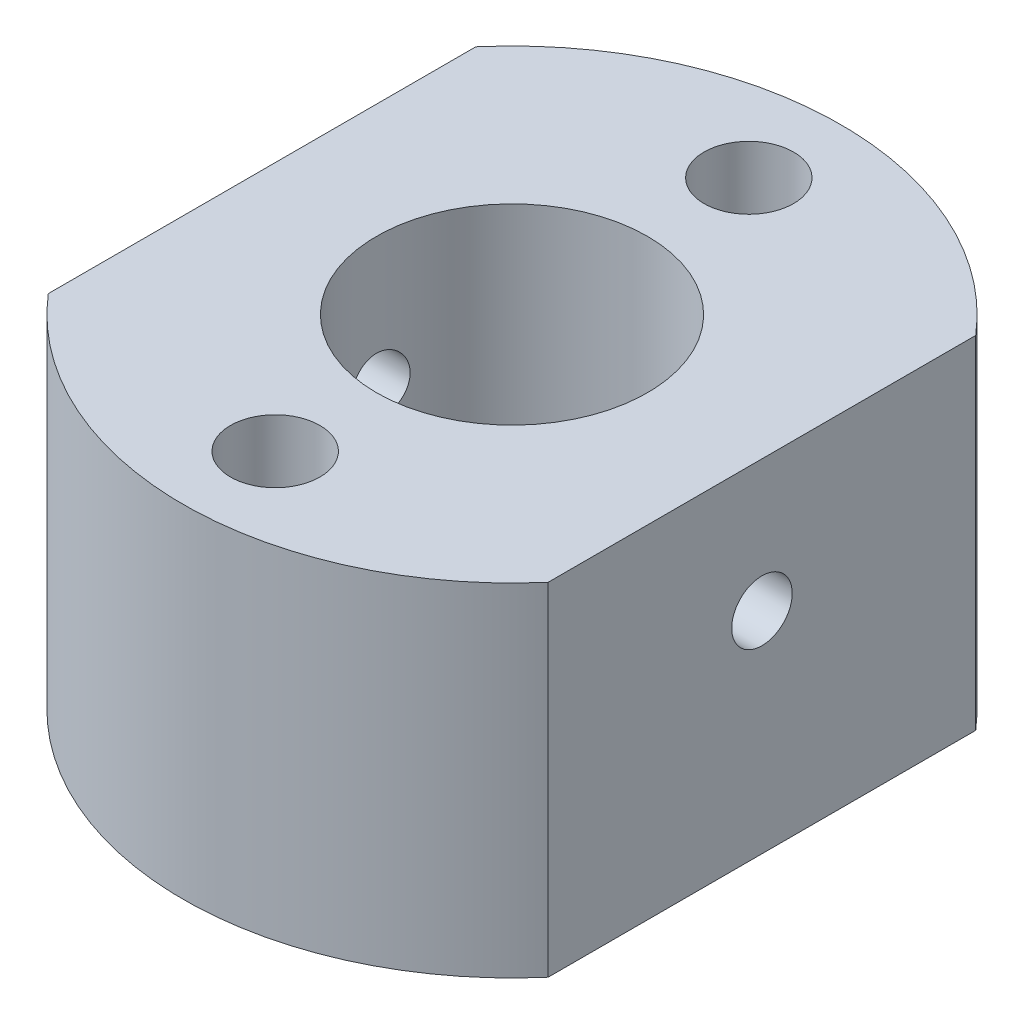
ISO-10303-21;
HEADER;
FILE_DESCRIPTION(('STEP AP214'),'2;1');
FILE_NAME('part.step','',(''),(''),'','','');
FILE_SCHEMA(('AUTOMOTIVE_DESIGN { 1 0 10303 214 1 1 1 1 }'));
ENDSEC;
DATA;
#1=APPLICATION_CONTEXT('core data for automotive mechanical design processes');
#2=APPLICATION_PROTOCOL_DEFINITION('international standard','automotive_design',2000,#1);
#3=PRODUCT_CONTEXT('',#1,'mechanical');
#4=PRODUCT('Part','Part','',(#3));
#5=PRODUCT_RELATED_PRODUCT_CATEGORY('part','',(#4));
#6=PRODUCT_DEFINITION_FORMATION('','',#4);
#7=PRODUCT_DEFINITION_CONTEXT('part definition',#1,'design');
#8=PRODUCT_DEFINITION('design','',#6,#7);
#9=PRODUCT_DEFINITION_SHAPE('','',#8);
#10=(LENGTH_UNIT() NAMED_UNIT(*) SI_UNIT(.MILLI.,.METRE.));
#11=(NAMED_UNIT(*) PLANE_ANGLE_UNIT() SI_UNIT($,.RADIAN.));
#12=(NAMED_UNIT(*) SI_UNIT($,.STERADIAN.) SOLID_ANGLE_UNIT());
#13=UNCERTAINTY_MEASURE_WITH_UNIT(LENGTH_MEASURE(1.E-05),#10,'distance_accuracy_value','');
#14=(GEOMETRIC_REPRESENTATION_CONTEXT(3) GLOBAL_UNCERTAINTY_ASSIGNED_CONTEXT((#13)) GLOBAL_UNIT_ASSIGNED_CONTEXT((#10,
#11,#12)) REPRESENTATION_CONTEXT('',''));
#15=CARTESIAN_POINT('',(0.,0.,0.));
#16=DIRECTION('',(0.,0.,1.));
#17=DIRECTION('',(1.,0.,0.));
#18=AXIS2_PLACEMENT_3D('',#15,#16,#17);
#19=CARTESIAN_POINT('',(-30.,8.,0.));
#20=DIRECTION('',(1.,0.,0.));
#21=DIRECTION('',(0.,0.,-1.));
#22=AXIS2_PLACEMENT_3D('',#19,#20,#21);
#23=CYLINDRICAL_SURFACE('',#22,1.15);
#24=CARTESIAN_POINT('',(5.01996015920446,8.,-1.15));
#25=CARTESIAN_POINT('',(5.01996144618436,7.93627408614581,-1.14999785500141));
#26=CARTESIAN_POINT('',(5.02118683554871,7.87252269176245,-1.14468503358324));
#27=CARTESIAN_POINT('',(5.02594650411922,7.74683532765452,-1.12359883078287));
#28=CARTESIAN_POINT('',(5.02948240705055,7.68490066665538,-1.10781809290088));
#29=CARTESIAN_POINT('',(5.03844313066154,7.56468302799714,-1.0663197533758));
#30=CARTESIAN_POINT('',(5.04386582787509,7.50639603176772,-1.04061331891514));
#31=CARTESIAN_POINT('',(5.05598657127394,7.39496003870444,-0.980025569180663));
#32=CARTESIAN_POINT('',(5.06268460255022,7.3418109818175,-0.945144361160827));
#33=CARTESIAN_POINT('',(5.07673304581199,7.2412236044887,-0.866542700558881));
#34=CARTESIAN_POINT('',(5.08409210007078,7.19388889511673,-0.822691177059024));
#35=CARTESIAN_POINT('',(5.09855784742948,7.10718204437733,-0.727676536560787));
#36=CARTESIAN_POINT('',(5.10566452035658,7.06781053833184,-0.676512836736153));
#37=CARTESIAN_POINT('',(5.11891910726237,6.99773589983633,-0.567629396385614));
#38=CARTESIAN_POINT('',(5.1250556340696,6.96713272026362,-0.509843823183602));
#39=CARTESIAN_POINT('',(5.13558075208989,6.91611055135396,-0.389789965176114));
#40=CARTESIAN_POINT('',(5.1399695478762,6.89569037001872,-0.327522206021947));
#41=CARTESIAN_POINT('',(5.14644363062737,6.86594056115,-0.201349279714289));
#42=CARTESIAN_POINT('',(5.14856531823395,6.85643548889891,-0.137487379351078));
#43=CARTESIAN_POINT('',(5.150392346618,6.84823686953825,-0.00904254290756566));
#44=CARTESIAN_POINT('',(5.15009797502408,6.84954203548451,0.0555403064305854));
#45=CARTESIAN_POINT('',(5.14715377216678,6.86279679539235,0.182383295520679));
#46=CARTESIAN_POINT('',(5.14454579716461,6.87455724692479,0.244664315127214));
#47=CARTESIAN_POINT('',(5.13731525227674,6.90808697661796,0.366345799906251));
#48=CARTESIAN_POINT('',(5.13269258881661,6.92985671967389,0.425746131139567));
#49=CARTESIAN_POINT('',(5.12188521387586,6.98295236773976,0.540501419490795));
#50=CARTESIAN_POINT('',(5.11568894423375,7.01434935523668,0.595822354633989));
#51=CARTESIAN_POINT('',(5.10241278694039,7.08575512476294,0.70047892725464));
#52=CARTESIAN_POINT('',(5.09533277424468,7.12576512606499,0.749813715775391));
#53=CARTESIAN_POINT('',(5.08088559254824,7.21428880850708,0.842223004282889));
#54=CARTESIAN_POINT('',(5.07351552566623,7.26296801061654,0.885138633969616));
#55=CARTESIAN_POINT('',(5.05946218977643,7.36690886367503,0.96222776726211));
#56=CARTESIAN_POINT('',(5.05277894101639,7.42217070858016,0.996401013182086));
#57=CARTESIAN_POINT('',(5.04084786569174,7.53797251622521,1.05511011869875));
#58=CARTESIAN_POINT('',(5.03560469479367,7.59852878266829,1.07961482953781));
#59=CARTESIAN_POINT('',(5.027211135079,7.72304479046884,1.1180515654989));
#60=CARTESIAN_POINT('',(5.0240603987105,7.78700396469849,1.13198534649978));
#61=CARTESIAN_POINT('',(5.02027963129785,7.91505554034238,1.14863592053319));
#62=CARTESIAN_POINT('',(5.01959751372509,7.97911629562799,1.15158453461648));
#63=CARTESIAN_POINT('',(5.02069053187803,8.10681404302228,1.14680968243556));
#64=CARTESIAN_POINT('',(5.02246549106664,8.17045106524544,1.13908698288847));
#65=CARTESIAN_POINT('',(5.02822338058637,8.29468041112667,1.11339016736195));
#66=CARTESIAN_POINT('',(5.03217857829787,8.35530075679089,1.09554473135104));
#67=CARTESIAN_POINT('',(5.0418260943487,8.47269087380142,1.05024879549898));
#68=CARTESIAN_POINT('',(5.04751858469059,8.52946026319905,1.02279734456432));
#69=CARTESIAN_POINT('',(5.06011305966654,8.63853730880166,0.95856145290376));
#70=CARTESIAN_POINT('',(5.06703292973731,8.69075910049446,0.921634787577442));
#71=CARTESIAN_POINT('',(5.08125577015493,8.78834993415477,0.839681897142961));
#72=CARTESIAN_POINT('',(5.08855879010248,8.83371808591959,0.794654621527373));
#73=CARTESIAN_POINT('',(5.1028974339963,8.91721902057919,0.696727542690013));
#74=CARTESIAN_POINT('',(5.10992506450556,8.95519342598895,0.643691321974526));
#75=CARTESIAN_POINT('',(5.12277172402382,9.02169391641005,0.531858096610749));
#76=CARTESIAN_POINT('',(5.12859081069878,9.05022045226752,0.473061367023712));
#77=CARTESIAN_POINT('',(5.13833114400079,9.09679757510956,0.351749995020986));
#78=CARTESIAN_POINT('',(5.14226466461949,9.11491607031735,0.289262456276952));
#79=CARTESIAN_POINT('',(5.1478438354328,9.14037392028573,0.162032412650774));
#80=CARTESIAN_POINT('',(5.14948983306023,9.14771491196115,0.0972902517358851));
#81=CARTESIAN_POINT('',(5.15029764439413,9.15133317732604,-0.0311100070130711));
#82=CARTESIAN_POINT('',(5.14951246317111,9.14784651292218,-0.0947612329767144));
#83=CARTESIAN_POINT('',(5.14566025486308,9.1304382133656,-0.220546086903893));
#84=CARTESIAN_POINT('',(5.14259327221564,9.1165167814276,-0.282679744397395));
#85=CARTESIAN_POINT('',(5.13452660237019,9.07874924782231,-0.403474104036066));
#86=CARTESIAN_POINT('',(5.12953369180321,9.05493792274266,-0.462146160880239));
#87=CARTESIAN_POINT('',(5.11814723955162,8.99809994082388,-0.574693041206362));
#88=CARTESIAN_POINT('',(5.1117535558096,8.9650723492372,-0.628567377354378));
#89=CARTESIAN_POINT('',(5.09810471530515,8.88997651818667,-0.731136720941618));
#90=CARTESIAN_POINT('',(5.09083507325497,8.84774305157684,-0.779708840287559));
#91=CARTESIAN_POINT('',(5.07632977226076,8.7557659112013,-0.869157135635299));
#92=CARTESIAN_POINT('',(5.06909412198245,8.70602041922911,-0.910031443066062));
#93=CARTESIAN_POINT('',(5.05536224457789,8.59958946108056,-0.983479492811113));
#94=CARTESIAN_POINT('',(5.04887785152385,8.54281620917435,-1.01592837470297));
#95=CARTESIAN_POINT('',(5.03753273981643,8.42448860809766,-1.07077270599597));
#96=CARTESIAN_POINT('',(5.03267067381953,8.36293827892658,-1.09317650318828));
#97=CARTESIAN_POINT('',(5.02600081428275,8.25112230538823,-1.12338516547385));
#98=CARTESIAN_POINT('',(5.0237508698246,8.20145432838289,-1.13334624287535));
#99=CARTESIAN_POINT('',(5.02073007044117,8.10119622452491,-1.14665433669804));
#100=CARTESIAN_POINT('',(5.01995913718548,8.05060614665122,-1.15000170339045));
#101=CARTESIAN_POINT('',(5.01996015920446,8.,-1.15));
#102=B_SPLINE_CURVE_WITH_KNOTS('',3,(#24,#25,#26,#27,#28,#29,#30,#31,#32,#33,#34,#35,#36,#37,
#38,#39,#40,#41,#42,#43,#44,#45,#46,#47,#48,#49,#50,#51,#52,#53,#54,#55,#56,#57,#58,#59,#60,#61,
#62,#63,#64,#65,#66,#67,#68,#69,#70,#71,#72,#73,#74,#75,#76,#77,#78,#79,#80,#81,#82,#83,#84,#85,
#86,#87,#88,#89,#90,#91,#92,#93,#94,#95,#96,#97,#98,#99,#100,#101),.UNSPECIFIED.,.T.,.F.,(4,2,2,
2,2,2,2,2,2,2,2,2,2,2,2,2,2,2,2,2,2,2,2,2,2,2,2,2,2,2,2,2,2,2,2,2,2,2,4),(0.,0.190992225204412,
0.382118815727523,0.573030997573828,0.763940947737764,0.95787020172545,1.15181492171907,
1.34788971401983,1.54394154886669,1.73679596857334,1.92962742955336,2.11903987261118,
2.30846111407746,2.49931606604396,2.69019805354603,2.88521742596534,3.08024254600841,
3.27589093885363,3.47150682650375,3.66297044184989,3.85442030155111,4.043489309007,
4.23257704152347,4.42468848554959,4.61682486105108,4.81270867578664,5.00858314172794,
5.20316465045912,5.39771660259396,5.58805698835913,5.77839366738509,5.96806664257744,
6.15775886209472,6.35118664730564,6.54466132493379,6.74085777759889,6.93689088106917,
7.08857003176347,7.24024114910598),.UNSPECIFIED.);
#103=CARTESIAN_POINT('',(5.01996015920446,8.,-1.15));
#104=VERTEX_POINT('',#103);
#105=EDGE_CURVE('E96',#104,#104,#102,.T.);
#106=ORIENTED_EDGE('',*,*,#105,.T.);
#107=EDGE_LOOP('',(#106));
#108=FACE_BOUND('',#107,.T.);
#109=CARTESIAN_POINT('',(9.5,8.,0.));
#110=DIRECTION('',(1.,0.,0.));
#111=DIRECTION('',(0.,0.,-1.));
#112=AXIS2_PLACEMENT_3D('',#109,#110,#111);
#113=CIRCLE('',#112,1.15);
#114=CARTESIAN_POINT('',(9.5,8.,-1.15));
#115=VERTEX_POINT('',#114);
#116=EDGE_CURVE('E124',#115,#115,#113,.T.);
#117=ORIENTED_EDGE('',*,*,#116,.T.);
#118=EDGE_LOOP('',(#117));
#119=FACE_BOUND('',#118,.T.);
#120=ADVANCED_FACE('F39',(#108,#119),#23,.F.);
#121=CARTESIAN_POINT('',(-30.,8.,0.));
#122=DIRECTION('',(1.,0.,0.));
#123=DIRECTION('',(0.,0.,-1.));
#124=AXIS2_PLACEMENT_3D('',#121,#122,#123);
#125=CYLINDRICAL_SURFACE('',#124,1.15);
#126=CARTESIAN_POINT('',(-5.01996015920445,8.,-1.15));
#127=CARTESIAN_POINT('',(-5.01996144618434,8.06372591385419,-1.14999785500141));
#128=CARTESIAN_POINT('',(-5.02118683554871,8.12747730823755,-1.14468503358324));
#129=CARTESIAN_POINT('',(-5.02594650411922,8.25316467234548,-1.12359883078287));
#130=CARTESIAN_POINT('',(-5.02948240705055,8.31509933334462,-1.10781809290088));
#131=CARTESIAN_POINT('',(-5.03844313066153,8.43531697200286,-1.0663197533758));
#132=CARTESIAN_POINT('',(-5.04386582787509,8.49360396823228,-1.04061331891514));
#133=CARTESIAN_POINT('',(-5.05598657127394,8.60503996129556,-0.980025569180664));
#134=CARTESIAN_POINT('',(-5.06268460255022,8.6581890181825,-0.945144361160829));
#135=CARTESIAN_POINT('',(-5.07673304581199,8.7587763955113,-0.866542700558883));
#136=CARTESIAN_POINT('',(-5.08409210007078,8.80611110488327,-0.822691177059026));
#137=CARTESIAN_POINT('',(-5.09855784742948,8.89281795562267,-0.727676536560789));
#138=CARTESIAN_POINT('',(-5.10566452035658,8.93218946166816,-0.676512836736155));
#139=CARTESIAN_POINT('',(-5.11891910726237,9.00226410016367,-0.567629396385616));
#140=CARTESIAN_POINT('',(-5.1250556340696,9.03286727973638,-0.509843823183604));
#141=CARTESIAN_POINT('',(-5.13558075208989,9.08388944864604,-0.389789965176117));
#142=CARTESIAN_POINT('',(-5.1399695478762,9.10430962998128,-0.327522206021951));
#143=CARTESIAN_POINT('',(-5.14644363062737,9.13405943885,-0.201349279714293));
#144=CARTESIAN_POINT('',(-5.14856531823395,9.14356451110109,-0.137487379351082));
#145=CARTESIAN_POINT('',(-5.150392346618,9.15176313046175,-0.00904254290756949));
#146=CARTESIAN_POINT('',(-5.15009797502408,9.15045796451549,0.0555403064305815));
#147=CARTESIAN_POINT('',(-5.14715377216678,9.13720320460765,0.182383295520675));
#148=CARTESIAN_POINT('',(-5.14454579716461,9.12544275307521,0.24466431512721));
#149=CARTESIAN_POINT('',(-5.13731525227674,9.09191302338204,0.366345799906248));
#150=CARTESIAN_POINT('',(-5.13269258881661,9.07014328032611,0.425746131139564));
#151=CARTESIAN_POINT('',(-5.12188521387586,9.01704763226024,0.540501419490792));
#152=CARTESIAN_POINT('',(-5.11568894423375,8.98565064476332,0.595822354633986));
#153=CARTESIAN_POINT('',(-5.1024127869404,8.91424487523707,0.700478927254638));
#154=CARTESIAN_POINT('',(-5.09533277424468,8.87423487393501,0.749813715775388));
#155=CARTESIAN_POINT('',(-5.08088559254824,8.78571119149292,0.842223004282886));
#156=CARTESIAN_POINT('',(-5.07351552566623,8.73703198938346,0.885138633969614));
#157=CARTESIAN_POINT('',(-5.05946218977643,8.63309113632497,0.962227767262108));
#158=CARTESIAN_POINT('',(-5.05277894101639,8.57782929141985,0.996401013182085));
#159=CARTESIAN_POINT('',(-5.04084786569174,8.46202748377479,1.05511011869875));
#160=CARTESIAN_POINT('',(-5.03560469479367,8.40147121733171,1.07961482953781));
#161=CARTESIAN_POINT('',(-5.027211135079,8.27695520953116,1.1180515654989));
#162=CARTESIAN_POINT('',(-5.0240603987105,8.21299603530151,1.13198534649978));
#163=CARTESIAN_POINT('',(-5.02027963129785,8.08494445965762,1.14863592053319));
#164=CARTESIAN_POINT('',(-5.01959751372509,8.02088370437202,1.15158453461648));
#165=CARTESIAN_POINT('',(-5.02069053187803,7.89318595697773,1.14680968243556));
#166=CARTESIAN_POINT('',(-5.02246549106664,7.82954893475456,1.13908698288847));
#167=CARTESIAN_POINT('',(-5.02822338058637,7.70531958887334,1.11339016736195));
#168=CARTESIAN_POINT('',(-5.03217857829787,7.64469924320912,1.09554473135104));
#169=CARTESIAN_POINT('',(-5.0418260943487,7.52730912619859,1.05024879549899));
#170=CARTESIAN_POINT('',(-5.04751858469059,7.47053973680096,1.02279734456432));
#171=CARTESIAN_POINT('',(-5.06011305966653,7.36146269119834,0.958561452903762));
#172=CARTESIAN_POINT('',(-5.06703292973731,7.30924089950554,0.921634787577443));
#173=CARTESIAN_POINT('',(-5.08125577015493,7.21165006584523,0.839681897142963));
#174=CARTESIAN_POINT('',(-5.08855879010248,7.16628191408041,0.794654621527375));
#175=CARTESIAN_POINT('',(-5.1028974339963,7.08278097942081,0.696727542690015));
#176=CARTESIAN_POINT('',(-5.10992506450556,7.04480657401106,0.643691321974529));
#177=CARTESIAN_POINT('',(-5.12277172402382,6.97830608358996,0.531858096610752));
#178=CARTESIAN_POINT('',(-5.12859081069878,6.94977954773248,0.473061367023715));
#179=CARTESIAN_POINT('',(-5.13833114400079,6.90320242489044,0.351749995020989));
#180=CARTESIAN_POINT('',(-5.14226466461949,6.88508392968265,0.289262456276955));
#181=CARTESIAN_POINT('',(-5.1478438354328,6.85962607971427,0.162032412650777));
#182=CARTESIAN_POINT('',(-5.14948983306023,6.85228508803885,0.0972902517358887));
#183=CARTESIAN_POINT('',(-5.15029764439413,6.84866682267396,-0.031110007013067));
#184=CARTESIAN_POINT('',(-5.14951246317111,6.85215348707782,-0.0947612329767101));
#185=CARTESIAN_POINT('',(-5.14566025486308,6.86956178663439,-0.220546086903889));
#186=CARTESIAN_POINT('',(-5.14259327221564,6.8834832185724,-0.282679744397391));
#187=CARTESIAN_POINT('',(-5.13452660237019,6.92125075217769,-0.403474104036063));
#188=CARTESIAN_POINT('',(-5.12953369180321,6.94506207725734,-0.462146160880236));
#189=CARTESIAN_POINT('',(-5.11814723955162,7.00190005917612,-0.574693041206359));
#190=CARTESIAN_POINT('',(-5.1117535558096,7.03492765076279,-0.628567377354375));
#191=CARTESIAN_POINT('',(-5.09810471530515,7.11002348181333,-0.731136720941615));
#192=CARTESIAN_POINT('',(-5.09083507325497,7.15225694842316,-0.779708840287556));
#193=CARTESIAN_POINT('',(-5.07632977226076,7.24423408879869,-0.869157135635297));
#194=CARTESIAN_POINT('',(-5.06909412198245,7.29397958077089,-0.91003144306606));
#195=CARTESIAN_POINT('',(-5.05536224457789,7.40041053891944,-0.983479492811111));
#196=CARTESIAN_POINT('',(-5.04887785152385,7.45718379082565,-1.01592837470297));
#197=CARTESIAN_POINT('',(-5.03753273981643,7.57551139190234,-1.07077270599597));
#198=CARTESIAN_POINT('',(-5.03267067381953,7.63706172107342,-1.09317650318827));
#199=CARTESIAN_POINT('',(-5.02600081428275,7.74887769461176,-1.12338516547385));
#200=CARTESIAN_POINT('',(-5.02375086982461,7.7985456716171,-1.13334624287535));
#201=CARTESIAN_POINT('',(-5.02073007044117,7.89880377547509,-1.14665433669804));
#202=CARTESIAN_POINT('',(-5.01995913718547,7.94939385334878,-1.15000170339045));
#203=CARTESIAN_POINT('',(-5.01996015920445,8.,-1.15));
#204=B_SPLINE_CURVE_WITH_KNOTS('',3,(#126,#127,#128,#129,#130,#131,#132,#133,#134,#135,#136,
#137,#138,#139,#140,#141,#142,#143,#144,#145,#146,#147,#148,#149,#150,#151,#152,#153,#154,#155,
#156,#157,#158,#159,#160,#161,#162,#163,#164,#165,#166,#167,#168,#169,#170,#171,#172,#173,#174,
#175,#176,#177,#178,#179,#180,#181,#182,#183,#184,#185,#186,#187,#188,#189,#190,#191,#192,#193,
#194,#195,#196,#197,#198,#199,#200,#201,#202,#203),.UNSPECIFIED.,.T.,.F.,(4,2,2,2,2,2,2,2,2,2,2,
2,2,2,2,2,2,2,2,2,2,2,2,2,2,2,2,2,2,2,2,2,2,2,2,2,2,2,4),(0.,0.190992225204411,
0.382118815727522,0.573030997573826,0.76394094773776,0.957870201725448,1.15181492171907,
1.34788971401983,1.54394154886669,1.73679596857334,1.92962742955336,2.11903987261117,
2.30846111407746,2.49931606604396,2.69019805354603,2.88521742596534,3.0802425460084,
3.27589093885363,3.47150682650375,3.66297044184989,3.85442030155111,4.04348930900699,
4.23257704152347,4.42468848554959,4.61682486105108,4.81270867578664,5.00858314172793,
5.20316465045912,5.39771660259396,5.58805698835913,5.77839366738509,5.96806664257743,
6.15775886209472,6.35118664730564,6.54466132493378,6.74085777759889,6.93689088106917,
7.08857003176347,7.24024114910598),.UNSPECIFIED.);
#205=CARTESIAN_POINT('',(-5.01996015920445,8.,-1.15));
#206=VERTEX_POINT('',#205);
#207=EDGE_CURVE('E178',#206,#206,#204,.T.);
#208=ORIENTED_EDGE('',*,*,#207,.T.);
#209=EDGE_LOOP('',(#208));
#210=FACE_BOUND('',#209,.T.);
#211=CARTESIAN_POINT('',(-9.5,8.,0.));
#212=DIRECTION('',(1.,0.,0.));
#213=DIRECTION('',(0.,0.,-1.));
#214=AXIS2_PLACEMENT_3D('',#211,#212,#213);
#215=CIRCLE('',#214,1.15);
#216=CARTESIAN_POINT('',(-9.5,8.,-1.15));
#217=VERTEX_POINT('',#216);
#218=EDGE_CURVE('E43',#217,#217,#215,.F.);
#219=ORIENTED_EDGE('',*,*,#218,.T.);
#220=EDGE_LOOP('',(#219));
#221=FACE_BOUND('',#220,.T.);
#222=ADVANCED_FACE('F173',(#210,#221),#125,.F.);
#223=CARTESIAN_POINT('',(12.5,13.,0.));
#224=DIRECTION('',(0.,1.,0.));
#225=DIRECTION('',(0.,0.,1.));
#226=AXIS2_PLACEMENT_3D('',#223,#224,#225);
#227=PLANE('',#226);
#228=CARTESIAN_POINT('',(0.,13.,0.));
#229=DIRECTION('',(0.,1.,0.));
#230=DIRECTION('',(0.,0.,1.));
#231=AXIS2_PLACEMENT_3D('',#228,#229,#230);
#232=CIRCLE('',#231,5.15);
#233=CARTESIAN_POINT('',(0.,13.,5.15));
#234=VERTEX_POINT('',#233);
#235=EDGE_CURVE('E184',#234,#234,#232,.T.);
#236=ORIENTED_EDGE('',*,*,#235,.F.);
#237=EDGE_LOOP('',(#236));
#238=FACE_BOUND('',#237,.T.);
#239=CARTESIAN_POINT('',(0.,13.,-9.));
#240=DIRECTION('',(0.,-1.,0.));
#241=DIRECTION('',(0.,0.,-1.));
#242=AXIS2_PLACEMENT_3D('',#239,#240,#241);
#243=CIRCLE('',#242,1.7);
#244=CARTESIAN_POINT('',(0.,13.,-10.7));
#245=VERTEX_POINT('',#244);
#246=EDGE_CURVE('E116',#245,#245,#243,.T.);
#247=ORIENTED_EDGE('',*,*,#246,.T.);
#248=EDGE_LOOP('',(#247));
#249=FACE_BOUND('',#248,.T.);
#250=CARTESIAN_POINT('',(0.,13.,9.));
#251=DIRECTION('',(0.,-1.,0.));
#252=DIRECTION('',(0.,0.,-1.));
#253=AXIS2_PLACEMENT_3D('',#250,#251,#252);
#254=CIRCLE('',#253,1.7);
#255=CARTESIAN_POINT('',(0.,13.,7.3));
#256=VERTEX_POINT('',#255);
#257=EDGE_CURVE('E119',#256,#256,#254,.T.);
#258=ORIENTED_EDGE('',*,*,#257,.T.);
#259=EDGE_LOOP('',(#258));
#260=FACE_BOUND('',#259,.T.);
#261=CARTESIAN_POINT('',(0.,13.,0.));
#262=DIRECTION('',(0.,-1.,0.));
#263=DIRECTION('',(0.,0.,-1.));
#264=AXIS2_PLACEMENT_3D('',#261,#262,#263);
#265=CIRCLE('',#264,12.5);
#266=CARTESIAN_POINT('',(-9.5,13.,-8.12403840463596));
#267=VERTEX_POINT('',#266);
#268=CARTESIAN_POINT('',(9.5,13.,-8.12403840463596));
#269=VERTEX_POINT('',#268);
#270=EDGE_CURVE('E80',#267,#269,#265,.T.);
#271=ORIENTED_EDGE('',*,*,#270,.F.);
#272=DIRECTION('',(0.,0.,-1.));
#273=VECTOR('',#272,1.);
#274=CARTESIAN_POINT('',(-9.5,13.,-10.));
#275=LINE('',#274,#273);
#276=CARTESIAN_POINT('',(-9.5,13.,8.12403840463596));
#277=VERTEX_POINT('',#276);
#278=EDGE_CURVE('E83',#267,#277,#275,.F.);
#279=ORIENTED_EDGE('',*,*,#278,.T.);
#280=CARTESIAN_POINT('',(0.,13.,0.));
#281=DIRECTION('',(0.,-1.,0.));
#282=DIRECTION('',(0.,0.,-1.));
#283=AXIS2_PLACEMENT_3D('',#280,#281,#282);
#284=CIRCLE('',#283,12.5);
#285=CARTESIAN_POINT('',(9.5,13.,8.12403840463596));
#286=VERTEX_POINT('',#285);
#287=EDGE_CURVE('E122',#286,#277,#284,.T.);
#288=ORIENTED_EDGE('',*,*,#287,.F.);
#289=DIRECTION('',(0.,0.,1.));
#290=VECTOR('',#289,1.);
#291=CARTESIAN_POINT('',(9.5,13.,-10.));
#292=LINE('',#291,#290);
#293=EDGE_CURVE('E78',#286,#269,#292,.F.);
#294=ORIENTED_EDGE('',*,*,#293,.T.);
#295=EDGE_LOOP('',(#271,#279,#288,#294));
#296=FACE_BOUND('',#295,.T.);
#297=ADVANCED_FACE('F82',(#238,#249,#260,#296),#227,.T.);
#298=CARTESIAN_POINT('',(-9.5,18.,-10.));
#299=DIRECTION('',(1.,0.,0.));
#300=DIRECTION('',(0.,0.,-1.));
#301=AXIS2_PLACEMENT_3D('',#298,#299,#300);
#302=PLANE('',#301);
#303=ORIENTED_EDGE('',*,*,#218,.F.);
#304=EDGE_LOOP('',(#303));
#305=FACE_BOUND('',#304,.T.);
#306=ORIENTED_EDGE('',*,*,#278,.F.);
#307=DIRECTION('',(0.,-1.,0.));
#308=VECTOR('',#307,1.);
#309=CARTESIAN_POINT('',(-9.5,0.,-8.12403840463596));
#310=LINE('',#309,#308);
#311=CARTESIAN_POINT('',(-9.5,0.,-8.12403840463596));
#312=VERTEX_POINT('',#311);
#313=EDGE_CURVE('E89',#312,#267,#310,.F.);
#314=ORIENTED_EDGE('',*,*,#313,.F.);
#315=DIRECTION('',(0.,0.,-1.));
#316=VECTOR('',#315,1.);
#317=CARTESIAN_POINT('',(-9.5,0.,0.));
#318=LINE('',#317,#316);
#319=CARTESIAN_POINT('',(-9.5,0.,8.12403840463596));
#320=VERTEX_POINT('',#319);
#321=EDGE_CURVE('E115',#320,#312,#318,.T.);
#322=ORIENTED_EDGE('',*,*,#321,.F.);
#323=DIRECTION('',(0.,-1.,0.));
#324=VECTOR('',#323,1.);
#325=CARTESIAN_POINT('',(-9.5,0.,8.12403840463596));
#326=LINE('',#325,#324);
#327=EDGE_CURVE('E94',#277,#320,#326,.T.);
#328=ORIENTED_EDGE('',*,*,#327,.F.);
#329=EDGE_LOOP('',(#306,#314,#322,#328));
#330=FACE_BOUND('',#329,.T.);
#331=ADVANCED_FACE('F91',(#305,#330),#302,.F.);
#332=CARTESIAN_POINT('',(0.,0.,0.));
#333=DIRECTION('',(0.,-1.,0.));
#334=DIRECTION('',(0.,0.,-1.));
#335=AXIS2_PLACEMENT_3D('',#332,#333,#334);
#336=CYLINDRICAL_SURFACE('',#335,12.5);
#337=DIRECTION('',(0.,1.,0.));
#338=VECTOR('',#337,1.);
#339=CARTESIAN_POINT('',(9.5,18.,-8.12403840463596));
#340=LINE('',#339,#338);
#341=CARTESIAN_POINT('',(9.5,0.,-8.12403840463596));
#342=VERTEX_POINT('',#341);
#343=EDGE_CURVE('E105',#269,#342,#340,.F.);
#344=ORIENTED_EDGE('',*,*,#343,.T.);
#345=CARTESIAN_POINT('',(0.,0.,0.));
#346=DIRECTION('',(0.,-1.,0.));
#347=DIRECTION('',(0.,0.,-1.));
#348=AXIS2_PLACEMENT_3D('',#345,#346,#347);
#349=CIRCLE('',#348,12.5);
#350=EDGE_CURVE('E99',#312,#342,#349,.T.);
#351=ORIENTED_EDGE('',*,*,#350,.F.);
#352=ORIENTED_EDGE('',*,*,#313,.T.);
#353=ORIENTED_EDGE('',*,*,#270,.T.);
#354=EDGE_LOOP('',(#344,#351,#352,#353));
#355=FACE_BOUND('',#354,.T.);
#356=ADVANCED_FACE('F98',(#355),#336,.T.);
#357=CARTESIAN_POINT('',(9.5,18.,-10.));
#358=DIRECTION('',(-1.,0.,0.));
#359=DIRECTION('',(0.,0.,1.));
#360=AXIS2_PLACEMENT_3D('',#357,#358,#359);
#361=PLANE('',#360);
#362=ORIENTED_EDGE('',*,*,#116,.F.);
#363=EDGE_LOOP('',(#362));
#364=FACE_BOUND('',#363,.T.);
#365=ORIENTED_EDGE('',*,*,#293,.F.);
#366=DIRECTION('',(0.,-1.,0.));
#367=VECTOR('',#366,1.);
#368=CARTESIAN_POINT('',(9.5,0.,8.12403840463596));
#369=LINE('',#368,#367);
#370=CARTESIAN_POINT('',(9.5,0.,8.12403840463596));
#371=VERTEX_POINT('',#370);
#372=EDGE_CURVE('E58',#371,#286,#369,.F.);
#373=ORIENTED_EDGE('',*,*,#372,.F.);
#374=DIRECTION('',(0.,0.,-1.));
#375=VECTOR('',#374,1.);
#376=CARTESIAN_POINT('',(9.5,0.,0.));
#377=LINE('',#376,#375);
#378=EDGE_CURVE('E113',#342,#371,#377,.F.);
#379=ORIENTED_EDGE('',*,*,#378,.F.);
#380=ORIENTED_EDGE('',*,*,#343,.F.);
#381=EDGE_LOOP('',(#365,#373,#379,#380));
#382=FACE_BOUND('',#381,.T.);
#383=ADVANCED_FACE('F130',(#364,#382),#361,.F.);
#384=CARTESIAN_POINT('',(0.,0.,0.));
#385=DIRECTION('',(0.,-1.,0.));
#386=DIRECTION('',(0.,0.,-1.));
#387=AXIS2_PLACEMENT_3D('',#384,#385,#386);
#388=CYLINDRICAL_SURFACE('',#387,12.5);
#389=ORIENTED_EDGE('',*,*,#372,.T.);
#390=ORIENTED_EDGE('',*,*,#287,.T.);
#391=ORIENTED_EDGE('',*,*,#327,.T.);
#392=CARTESIAN_POINT('',(0.,0.,0.));
#393=DIRECTION('',(0.,-1.,0.));
#394=DIRECTION('',(0.,0.,-1.));
#395=AXIS2_PLACEMENT_3D('',#392,#393,#394);
#396=CIRCLE('',#395,12.5);
#397=EDGE_CURVE('E110',#371,#320,#396,.T.);
#398=ORIENTED_EDGE('',*,*,#397,.F.);
#399=EDGE_LOOP('',(#389,#390,#391,#398));
#400=FACE_BOUND('',#399,.T.);
#401=ADVANCED_FACE('F140',(#400),#388,.T.);
#402=CARTESIAN_POINT('',(0.,13.,9.));
#403=DIRECTION('',(0.,-1.,0.));
#404=DIRECTION('',(0.,0.,-1.));
#405=AXIS2_PLACEMENT_3D('',#402,#403,#404);
#406=CYLINDRICAL_SURFACE('',#405,1.7);
#407=CARTESIAN_POINT('',(0.,0.,9.));
#408=DIRECTION('',(0.,-1.,0.));
#409=DIRECTION('',(0.,0.,-1.));
#410=AXIS2_PLACEMENT_3D('',#407,#408,#409);
#411=CIRCLE('',#410,1.7);
#412=CARTESIAN_POINT('',(0.,0.,7.3));
#413=VERTEX_POINT('',#412);
#414=EDGE_CURVE('E49',#413,#413,#411,.F.);
#415=ORIENTED_EDGE('',*,*,#414,.F.);
#416=EDGE_LOOP('',(#415));
#417=FACE_BOUND('',#416,.T.);
#418=ORIENTED_EDGE('',*,*,#257,.F.);
#419=EDGE_LOOP('',(#418));
#420=FACE_BOUND('',#419,.T.);
#421=ADVANCED_FACE('F152',(#417,#420),#406,.F.);
#422=CARTESIAN_POINT('',(0.,13.,-9.));
#423=DIRECTION('',(0.,-1.,0.));
#424=DIRECTION('',(0.,0.,-1.));
#425=AXIS2_PLACEMENT_3D('',#422,#423,#424);
#426=CYLINDRICAL_SURFACE('',#425,1.7);
#427=CARTESIAN_POINT('',(0.,0.,-9.));
#428=DIRECTION('',(0.,-1.,0.));
#429=DIRECTION('',(0.,0.,-1.));
#430=AXIS2_PLACEMENT_3D('',#427,#428,#429);
#431=CIRCLE('',#430,1.7);
#432=CARTESIAN_POINT('',(0.,0.,-10.7));
#433=VERTEX_POINT('',#432);
#434=EDGE_CURVE('E11',#433,#433,#431,.F.);
#435=ORIENTED_EDGE('',*,*,#434,.F.);
#436=EDGE_LOOP('',(#435));
#437=FACE_BOUND('',#436,.T.);
#438=ORIENTED_EDGE('',*,*,#246,.F.);
#439=EDGE_LOOP('',(#438));
#440=FACE_BOUND('',#439,.T.);
#441=ADVANCED_FACE('F144',(#437,#440),#426,.F.);
#442=CARTESIAN_POINT('',(12.5,0.,0.));
#443=DIRECTION('',(0.,-1.,0.));
#444=DIRECTION('',(0.,0.,-1.));
#445=AXIS2_PLACEMENT_3D('',#442,#443,#444);
#446=PLANE('',#445);
#447=CARTESIAN_POINT('',(0.,0.,0.));
#448=DIRECTION('',(0.,1.,0.));
#449=DIRECTION('',(0.,0.,1.));
#450=AXIS2_PLACEMENT_3D('',#447,#448,#449);
#451=CIRCLE('',#450,5.15);
#452=CARTESIAN_POINT('',(0.,0.,5.15));
#453=VERTEX_POINT('',#452);
#454=EDGE_CURVE('E183',#453,#453,#451,.T.);
#455=ORIENTED_EDGE('',*,*,#454,.T.);
#456=EDGE_LOOP('',(#455));
#457=FACE_BOUND('',#456,.T.);
#458=ORIENTED_EDGE('',*,*,#434,.T.);
#459=EDGE_LOOP('',(#458));
#460=FACE_BOUND('',#459,.T.);
#461=ORIENTED_EDGE('',*,*,#414,.T.);
#462=EDGE_LOOP('',(#461));
#463=FACE_BOUND('',#462,.T.);
#464=ORIENTED_EDGE('',*,*,#378,.T.);
#465=ORIENTED_EDGE('',*,*,#397,.T.);
#466=ORIENTED_EDGE('',*,*,#321,.T.);
#467=ORIENTED_EDGE('',*,*,#350,.T.);
#468=EDGE_LOOP('',(#464,#465,#466,#467));
#469=FACE_BOUND('',#468,.T.);
#470=ADVANCED_FACE('F141',(#457,#460,#463,#469),#446,.T.);
#471=CARTESIAN_POINT('',(0.,0.,0.));
#472=DIRECTION('',(0.,1.,0.));
#473=DIRECTION('',(0.,0.,1.));
#474=AXIS2_PLACEMENT_3D('',#471,#472,#473);
#475=CYLINDRICAL_SURFACE('',#474,5.15);
#476=ORIENTED_EDGE('',*,*,#207,.F.);
#477=EDGE_LOOP('',(#476));
#478=FACE_BOUND('',#477,.T.);
#479=ORIENTED_EDGE('',*,*,#454,.F.);
#480=EDGE_LOOP('',(#479));
#481=FACE_BOUND('',#480,.T.);
#482=ORIENTED_EDGE('',*,*,#235,.T.);
#483=EDGE_LOOP('',(#482));
#484=FACE_BOUND('',#483,.T.);
#485=ORIENTED_EDGE('',*,*,#105,.F.);
#486=EDGE_LOOP('',(#485));
#487=FACE_BOUND('',#486,.T.);
#488=ADVANCED_FACE('F143',(#478,#481,#484,#487),#475,.F.);
#489=CLOSED_SHELL('',(#120,#222,#297,#331,#356,#383,#401,#421,#441,#470,#488));
#490=MANIFOLD_SOLID_BREP('B2',#489);
#491=ADVANCED_BREP_SHAPE_REPRESENTATION('',(#18,#490),#14);
#492=SHAPE_DEFINITION_REPRESENTATION(#9,#491);
ENDSEC;
END-ISO-10303-21;
